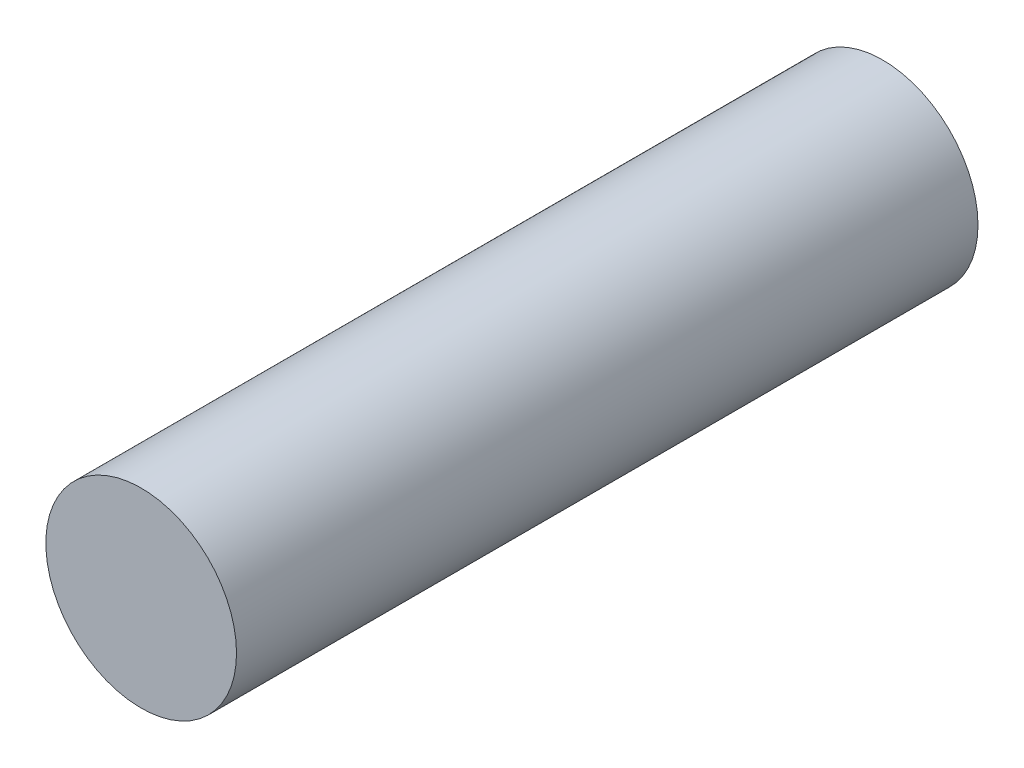
ISO-10303-21;
HEADER;
FILE_DESCRIPTION(('STEP AP214'),'2;1');
FILE_NAME('part.step','',(''),(''),'','','');
FILE_SCHEMA(('AUTOMOTIVE_DESIGN { 1 0 10303 214 1 1 1 1 }'));
ENDSEC;
DATA;
#1=APPLICATION_CONTEXT('core data for automotive mechanical design processes');
#2=APPLICATION_PROTOCOL_DEFINITION('international standard','automotive_design',2000,#1);
#3=PRODUCT_CONTEXT('',#1,'mechanical');
#4=PRODUCT('Part','Part','',(#3));
#5=PRODUCT_RELATED_PRODUCT_CATEGORY('part','',(#4));
#6=PRODUCT_DEFINITION_FORMATION('','',#4);
#7=PRODUCT_DEFINITION_CONTEXT('part definition',#1,'design');
#8=PRODUCT_DEFINITION('design','',#6,#7);
#9=PRODUCT_DEFINITION_SHAPE('','',#8);
#10=(LENGTH_UNIT() NAMED_UNIT(*) SI_UNIT(.MILLI.,.METRE.));
#11=(NAMED_UNIT(*) PLANE_ANGLE_UNIT() SI_UNIT($,.RADIAN.));
#12=(NAMED_UNIT(*) SI_UNIT($,.STERADIAN.) SOLID_ANGLE_UNIT());
#13=UNCERTAINTY_MEASURE_WITH_UNIT(LENGTH_MEASURE(1.E-05),#10,'distance_accuracy_value','');
#14=(GEOMETRIC_REPRESENTATION_CONTEXT(3) GLOBAL_UNCERTAINTY_ASSIGNED_CONTEXT((#13)) GLOBAL_UNIT_ASSIGNED_CONTEXT((#10,
#11,#12)) REPRESENTATION_CONTEXT('',''));
#15=CARTESIAN_POINT('',(0.,0.,0.));
#16=DIRECTION('',(0.,0.,1.));
#17=DIRECTION('',(1.,0.,0.));
#18=AXIS2_PLACEMENT_3D('',#15,#16,#17);
#19=CARTESIAN_POINT('',(0.,0.,70.));
#20=DIRECTION('',(0.,0.,-1.));
#21=DIRECTION('',(-1.,0.,0.));
#22=AXIS2_PLACEMENT_3D('',#19,#20,#21);
#23=CYLINDRICAL_SURFACE('',#22,9.);
#24=CARTESIAN_POINT('',(0.,0.,70.));
#25=DIRECTION('',(0.,0.,1.));
#26=DIRECTION('',(1.,0.,0.));
#27=AXIS2_PLACEMENT_3D('',#24,#25,#26);
#28=CIRCLE('',#27,9.);
#29=CARTESIAN_POINT('',(9.,0.,70.));
#30=VERTEX_POINT('',#29);
#31=EDGE_CURVE('E10',#30,#30,#28,.T.);
#32=ORIENTED_EDGE('',*,*,#31,.F.);
#33=EDGE_LOOP('',(#32));
#34=FACE_BOUND('',#33,.T.);
#35=CARTESIAN_POINT('',(0.,0.,0.));
#36=DIRECTION('',(0.,0.,1.));
#37=DIRECTION('',(1.,0.,0.));
#38=AXIS2_PLACEMENT_3D('',#35,#36,#37);
#39=CIRCLE('',#38,9.);
#40=CARTESIAN_POINT('',(9.,0.,0.));
#41=VERTEX_POINT('',#40);
#42=EDGE_CURVE('E48',#41,#41,#39,.T.);
#43=ORIENTED_EDGE('',*,*,#42,.T.);
#44=EDGE_LOOP('',(#43));
#45=FACE_BOUND('',#44,.T.);
#46=ADVANCED_FACE('F45',(#34,#45),#23,.T.);
#47=CARTESIAN_POINT('',(0.,0.,70.));
#48=DIRECTION('',(0.,0.,1.));
#49=DIRECTION('',(1.,0.,0.));
#50=AXIS2_PLACEMENT_3D('',#47,#48,#49);
#51=PLANE('',#50);
#52=ORIENTED_EDGE('',*,*,#31,.T.);
#53=EDGE_LOOP('',(#52));
#54=FACE_BOUND('',#53,.T.);
#55=ADVANCED_FACE('F62',(#54),#51,.T.);
#56=CARTESIAN_POINT('',(0.,0.,0.));
#57=DIRECTION('',(0.,0.,1.));
#58=DIRECTION('',(1.,0.,0.));
#59=AXIS2_PLACEMENT_3D('',#56,#57,#58);
#60=PLANE('',#59);
#61=ORIENTED_EDGE('',*,*,#42,.F.);
#62=EDGE_LOOP('',(#61));
#63=FACE_BOUND('',#62,.T.);
#64=ADVANCED_FACE('F60',(#63),#60,.F.);
#65=CLOSED_SHELL('',(#46,#55,#64));
#66=MANIFOLD_SOLID_BREP('B2',#65);
#67=ADVANCED_BREP_SHAPE_REPRESENTATION('',(#18,#66),#14);
#68=SHAPE_DEFINITION_REPRESENTATION(#9,#67);
ENDSEC;
END-ISO-10303-21;
